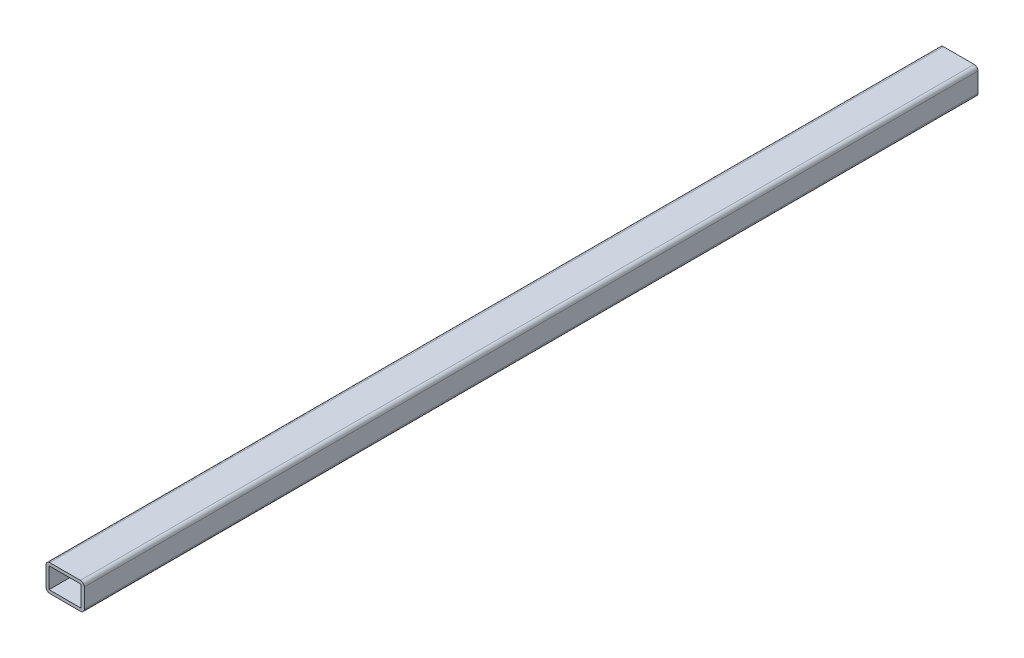
ISO-10303-21;
HEADER;
FILE_DESCRIPTION(('STEP AP214'),'2;1');
FILE_NAME('part.step','',(''),(''),'','','');
FILE_SCHEMA(('AUTOMOTIVE_DESIGN { 1 0 10303 214 1 1 1 1 }'));
ENDSEC;
DATA;
#1=APPLICATION_CONTEXT('core data for automotive mechanical design processes');
#2=APPLICATION_PROTOCOL_DEFINITION('international standard','automotive_design',2000,#1);
#3=PRODUCT_CONTEXT('',#1,'mechanical');
#4=PRODUCT('Part','Part','',(#3));
#5=PRODUCT_RELATED_PRODUCT_CATEGORY('part','',(#4));
#6=PRODUCT_DEFINITION_FORMATION('','',#4);
#7=PRODUCT_DEFINITION_CONTEXT('part definition',#1,'design');
#8=PRODUCT_DEFINITION('design','',#6,#7);
#9=PRODUCT_DEFINITION_SHAPE('','',#8);
#10=(LENGTH_UNIT() NAMED_UNIT(*) SI_UNIT(.MILLI.,.METRE.));
#11=(NAMED_UNIT(*) PLANE_ANGLE_UNIT() SI_UNIT($,.RADIAN.));
#12=(NAMED_UNIT(*) SI_UNIT($,.STERADIAN.) SOLID_ANGLE_UNIT());
#13=UNCERTAINTY_MEASURE_WITH_UNIT(LENGTH_MEASURE(1.E-05),#10,'distance_accuracy_value','');
#14=(GEOMETRIC_REPRESENTATION_CONTEXT(3) GLOBAL_UNCERTAINTY_ASSIGNED_CONTEXT((#13)) GLOBAL_UNIT_ASSIGNED_CONTEXT((#10,
#11,#12)) REPRESENTATION_CONTEXT('',''));
#15=CARTESIAN_POINT('',(0.,0.,0.));
#16=DIRECTION('',(0.,0.,1.));
#17=DIRECTION('',(1.,0.,0.));
#18=AXIS2_PLACEMENT_3D('',#15,#16,#17);
#19=CARTESIAN_POINT('',(2.99999999999999,18.,700.));
#20=DIRECTION('',(0.,0.,-1.));
#21=DIRECTION('',(-1.,0.,0.));
#22=AXIS2_PLACEMENT_3D('',#19,#20,#21);
#23=PLANE('',#22);
#24=CARTESIAN_POINT('',(2.99999999999999,18.,700.));
#25=DIRECTION('',(0.,0.,1.));
#26=DIRECTION('',(-1.,0.,0.));
#27=AXIS2_PLACEMENT_3D('',#24,#25,#26);
#28=CIRCLE('',#27,3.);
#29=CARTESIAN_POINT('',(3.00000000000001,21.,700.));
#30=VERTEX_POINT('',#29);
#31=CARTESIAN_POINT('',(0.,18.,700.));
#32=VERTEX_POINT('',#31);
#33=EDGE_CURVE('E181',#30,#32,#28,.T.);
#34=ORIENTED_EDGE('',*,*,#33,.T.);
#35=DIRECTION('',(0.,-1.,0.));
#36=VECTOR('',#35,1.);
#37=CARTESIAN_POINT('',(0.,18.,700.));
#38=LINE('',#37,#36);
#39=CARTESIAN_POINT('',(0.,3.00000000000002,700.));
#40=VERTEX_POINT('',#39);
#41=EDGE_CURVE('E185',#32,#40,#38,.T.);
#42=ORIENTED_EDGE('',*,*,#41,.T.);
#43=CARTESIAN_POINT('',(3.,3.,700.));
#44=DIRECTION('',(0.,0.,1.));
#45=DIRECTION('',(-1.,0.,0.));
#46=AXIS2_PLACEMENT_3D('',#43,#44,#45);
#47=CIRCLE('',#46,3.);
#48=CARTESIAN_POINT('',(3.00000000000002,0.,700.));
#49=VERTEX_POINT('',#48);
#50=EDGE_CURVE('E189',#40,#49,#47,.T.);
#51=ORIENTED_EDGE('',*,*,#50,.T.);
#52=DIRECTION('',(1.,0.,0.));
#53=VECTOR('',#52,1.);
#54=CARTESIAN_POINT('',(3.00000000000002,0.,700.));
#55=LINE('',#54,#53);
#56=CARTESIAN_POINT('',(27.,0.,700.));
#57=VERTEX_POINT('',#56);
#58=EDGE_CURVE('E192',#49,#57,#55,.T.);
#59=ORIENTED_EDGE('',*,*,#58,.T.);
#60=CARTESIAN_POINT('',(27.,3.,700.));
#61=DIRECTION('',(0.,0.,1.));
#62=DIRECTION('',(1.,0.,0.));
#63=AXIS2_PLACEMENT_3D('',#60,#61,#62);
#64=CIRCLE('',#63,3.);
#65=CARTESIAN_POINT('',(30.,3.,700.));
#66=VERTEX_POINT('',#65);
#67=EDGE_CURVE('E195',#57,#66,#64,.T.);
#68=ORIENTED_EDGE('',*,*,#67,.T.);
#69=DIRECTION('',(0.,1.,0.));
#70=VECTOR('',#69,1.);
#71=CARTESIAN_POINT('',(30.,3.00000000000002,700.));
#72=LINE('',#71,#70);
#73=CARTESIAN_POINT('',(30.,18.,700.));
#74=VERTEX_POINT('',#73);
#75=EDGE_CURVE('E198',#66,#74,#72,.T.);
#76=ORIENTED_EDGE('',*,*,#75,.T.);
#77=CARTESIAN_POINT('',(27.,18.,700.));
#78=DIRECTION('',(0.,0.,1.));
#79=DIRECTION('',(-1.,0.,0.));
#80=AXIS2_PLACEMENT_3D('',#77,#78,#79);
#81=CIRCLE('',#80,3.);
#82=CARTESIAN_POINT('',(27.,21.,700.));
#83=VERTEX_POINT('',#82);
#84=EDGE_CURVE('E201',#74,#83,#81,.T.);
#85=ORIENTED_EDGE('',*,*,#84,.T.);
#86=DIRECTION('',(-1.,0.,0.));
#87=VECTOR('',#86,1.);
#88=CARTESIAN_POINT('',(27.,21.,700.));
#89=LINE('',#88,#87);
#90=EDGE_CURVE('E204',#83,#30,#89,.T.);
#91=ORIENTED_EDGE('',*,*,#90,.T.);
#92=EDGE_LOOP('',(#34,#42,#51,#59,#68,#76,#85,#91));
#93=FACE_BOUND('',#92,.T.);
#94=DIRECTION('',(0.,-1.,0.));
#95=VECTOR('',#94,1.);
#96=CARTESIAN_POINT('',(2.39999999999999,18.6,700.));
#97=LINE('',#96,#95);
#98=CARTESIAN_POINT('',(2.39999999999999,18.6,700.));
#99=VERTEX_POINT('',#98);
#100=CARTESIAN_POINT('',(2.39999999999999,2.4,700.));
#101=VERTEX_POINT('',#100);
#102=EDGE_CURVE('E133',#99,#101,#97,.T.);
#103=ORIENTED_EDGE('',*,*,#102,.F.);
#104=DIRECTION('',(-1.,0.,0.));
#105=VECTOR('',#104,1.);
#106=CARTESIAN_POINT('',(27.6,18.6,700.));
#107=LINE('',#106,#105);
#108=CARTESIAN_POINT('',(27.6,18.6,700.));
#109=VERTEX_POINT('',#108);
#110=EDGE_CURVE('E159',#109,#99,#107,.T.);
#111=ORIENTED_EDGE('',*,*,#110,.F.);
#112=DIRECTION('',(0.,1.,0.));
#113=VECTOR('',#112,1.);
#114=CARTESIAN_POINT('',(27.6,2.4,700.));
#115=LINE('',#114,#113);
#116=CARTESIAN_POINT('',(27.6,2.4,700.));
#117=VERTEX_POINT('',#116);
#118=EDGE_CURVE('E155',#117,#109,#115,.T.);
#119=ORIENTED_EDGE('',*,*,#118,.F.);
#120=DIRECTION('',(1.,0.,0.));
#121=VECTOR('',#120,1.);
#122=CARTESIAN_POINT('',(2.39999999999999,2.4,700.));
#123=LINE('',#122,#121);
#124=EDGE_CURVE('E142',#101,#117,#123,.T.);
#125=ORIENTED_EDGE('',*,*,#124,.F.);
#126=EDGE_LOOP('',(#103,#111,#119,#125));
#127=FACE_BOUND('',#126,.T.);
#128=ADVANCED_FACE('F43',(#93,#127),#23,.F.);
#129=CARTESIAN_POINT('',(2.99999999999999,18.,0.));
#130=DIRECTION('',(0.,0.,-1.));
#131=DIRECTION('',(-1.,0.,0.));
#132=AXIS2_PLACEMENT_3D('',#129,#130,#131);
#133=PLANE('',#132);
#134=CARTESIAN_POINT('',(2.99999999999999,18.,0.));
#135=DIRECTION('',(0.,0.,1.));
#136=DIRECTION('',(-1.,0.,0.));
#137=AXIS2_PLACEMENT_3D('',#134,#135,#136);
#138=CIRCLE('',#137,3.);
#139=CARTESIAN_POINT('',(3.00000000000001,21.,0.));
#140=VERTEX_POINT('',#139);
#141=CARTESIAN_POINT('',(0.,18.,0.));
#142=VERTEX_POINT('',#141);
#143=EDGE_CURVE('E151',#140,#142,#138,.T.);
#144=ORIENTED_EDGE('',*,*,#143,.F.);
#145=DIRECTION('',(-1.,0.,0.));
#146=VECTOR('',#145,1.);
#147=CARTESIAN_POINT('',(27.,21.,0.));
#148=LINE('',#147,#146);
#149=CARTESIAN_POINT('',(27.,21.,0.));
#150=VERTEX_POINT('',#149);
#151=EDGE_CURVE('E186',#150,#140,#148,.T.);
#152=ORIENTED_EDGE('',*,*,#151,.F.);
#153=CARTESIAN_POINT('',(27.,18.,0.));
#154=DIRECTION('',(0.,0.,1.));
#155=DIRECTION('',(-1.,0.,0.));
#156=AXIS2_PLACEMENT_3D('',#153,#154,#155);
#157=CIRCLE('',#156,3.);
#158=CARTESIAN_POINT('',(30.,18.,0.));
#159=VERTEX_POINT('',#158);
#160=EDGE_CURVE('E226',#159,#150,#157,.T.);
#161=ORIENTED_EDGE('',*,*,#160,.F.);
#162=DIRECTION('',(0.,1.,0.));
#163=VECTOR('',#162,1.);
#164=CARTESIAN_POINT('',(30.,3.00000000000002,0.));
#165=LINE('',#164,#163);
#166=CARTESIAN_POINT('',(30.,3.,0.));
#167=VERTEX_POINT('',#166);
#168=EDGE_CURVE('E223',#167,#159,#165,.T.);
#169=ORIENTED_EDGE('',*,*,#168,.F.);
#170=CARTESIAN_POINT('',(27.,3.,0.));
#171=DIRECTION('',(0.,0.,1.));
#172=DIRECTION('',(1.,0.,0.));
#173=AXIS2_PLACEMENT_3D('',#170,#171,#172);
#174=CIRCLE('',#173,3.);
#175=CARTESIAN_POINT('',(27.,0.,0.));
#176=VERTEX_POINT('',#175);
#177=EDGE_CURVE('E220',#176,#167,#174,.T.);
#178=ORIENTED_EDGE('',*,*,#177,.F.);
#179=DIRECTION('',(1.,0.,0.));
#180=VECTOR('',#179,1.);
#181=CARTESIAN_POINT('',(3.00000000000002,0.,0.));
#182=LINE('',#181,#180);
#183=CARTESIAN_POINT('',(3.00000000000002,0.,0.));
#184=VERTEX_POINT('',#183);
#185=EDGE_CURVE('E217',#184,#176,#182,.T.);
#186=ORIENTED_EDGE('',*,*,#185,.F.);
#187=CARTESIAN_POINT('',(3.,3.,0.));
#188=DIRECTION('',(0.,0.,1.));
#189=DIRECTION('',(-1.,0.,0.));
#190=AXIS2_PLACEMENT_3D('',#187,#188,#189);
#191=CIRCLE('',#190,3.);
#192=CARTESIAN_POINT('',(0.,3.00000000000002,0.));
#193=VERTEX_POINT('',#192);
#194=EDGE_CURVE('E214',#193,#184,#191,.T.);
#195=ORIENTED_EDGE('',*,*,#194,.F.);
#196=DIRECTION('',(0.,-1.,0.));
#197=VECTOR('',#196,1.);
#198=CARTESIAN_POINT('',(0.,18.,0.));
#199=LINE('',#198,#197);
#200=EDGE_CURVE('E211',#142,#193,#199,.T.);
#201=ORIENTED_EDGE('',*,*,#200,.F.);
#202=EDGE_LOOP('',(#144,#152,#161,#169,#178,#186,#195,#201));
#203=FACE_BOUND('',#202,.T.);
#204=DIRECTION('',(-1.,0.,0.));
#205=VECTOR('',#204,1.);
#206=CARTESIAN_POINT('',(27.6,18.6,0.));
#207=LINE('',#206,#205);
#208=CARTESIAN_POINT('',(27.6,18.6,0.));
#209=VERTEX_POINT('',#208);
#210=CARTESIAN_POINT('',(2.39999999999999,18.6,0.));
#211=VERTEX_POINT('',#210);
#212=EDGE_CURVE('E143',#209,#211,#207,.T.);
#213=ORIENTED_EDGE('',*,*,#212,.T.);
#214=DIRECTION('',(0.,-1.,0.));
#215=VECTOR('',#214,1.);
#216=CARTESIAN_POINT('',(2.39999999999999,18.6,0.));
#217=LINE('',#216,#215);
#218=CARTESIAN_POINT('',(2.39999999999999,2.4,0.));
#219=VERTEX_POINT('',#218);
#220=EDGE_CURVE('E67',#211,#219,#217,.T.);
#221=ORIENTED_EDGE('',*,*,#220,.T.);
#222=DIRECTION('',(1.,0.,0.));
#223=VECTOR('',#222,1.);
#224=CARTESIAN_POINT('',(2.39999999999999,2.4,0.));
#225=LINE('',#224,#223);
#226=CARTESIAN_POINT('',(27.6,2.4,0.));
#227=VERTEX_POINT('',#226);
#228=EDGE_CURVE('E149',#219,#227,#225,.T.);
#229=ORIENTED_EDGE('',*,*,#228,.T.);
#230=DIRECTION('',(0.,1.,0.));
#231=VECTOR('',#230,1.);
#232=CARTESIAN_POINT('',(27.6,2.4,0.));
#233=LINE('',#232,#231);
#234=EDGE_CURVE('E168',#227,#209,#233,.T.);
#235=ORIENTED_EDGE('',*,*,#234,.T.);
#236=EDGE_LOOP('',(#213,#221,#229,#235));
#237=FACE_BOUND('',#236,.T.);
#238=ADVANCED_FACE('F265',(#203,#237),#133,.T.);
#239=CARTESIAN_POINT('',(2.99999999999999,18.,700.));
#240=DIRECTION('',(0.,0.,-1.));
#241=DIRECTION('',(-1.,0.,0.));
#242=AXIS2_PLACEMENT_3D('',#239,#240,#241);
#243=CYLINDRICAL_SURFACE('',#242,3.);
#244=ORIENTED_EDGE('',*,*,#143,.T.);
#245=DIRECTION('',(0.,0.,-1.));
#246=VECTOR('',#245,1.);
#247=CARTESIAN_POINT('',(0.,18.,700.));
#248=LINE('',#247,#246);
#249=EDGE_CURVE('E11',#32,#142,#248,.T.);
#250=ORIENTED_EDGE('',*,*,#249,.F.);
#251=ORIENTED_EDGE('',*,*,#33,.F.);
#252=DIRECTION('',(0.,0.,-1.));
#253=VECTOR('',#252,1.);
#254=CARTESIAN_POINT('',(3.00000000000001,21.,700.));
#255=LINE('',#254,#253);
#256=EDGE_CURVE('E207',#30,#140,#255,.T.);
#257=ORIENTED_EDGE('',*,*,#256,.T.);
#258=EDGE_LOOP('',(#244,#250,#251,#257));
#259=FACE_BOUND('',#258,.T.);
#260=ADVANCED_FACE('F45',(#259),#243,.T.);
#261=CARTESIAN_POINT('',(0.,18.,700.));
#262=DIRECTION('',(1.,0.,0.));
#263=DIRECTION('',(0.,1.,0.));
#264=AXIS2_PLACEMENT_3D('',#261,#262,#263);
#265=PLANE('',#264);
#266=ORIENTED_EDGE('',*,*,#200,.T.);
#267=DIRECTION('',(0.,0.,-1.));
#268=VECTOR('',#267,1.);
#269=CARTESIAN_POINT('',(0.,3.00000000000002,700.));
#270=LINE('',#269,#268);
#271=EDGE_CURVE('E52',#40,#193,#270,.T.);
#272=ORIENTED_EDGE('',*,*,#271,.F.);
#273=ORIENTED_EDGE('',*,*,#41,.F.);
#274=ORIENTED_EDGE('',*,*,#249,.T.);
#275=EDGE_LOOP('',(#266,#272,#273,#274));
#276=FACE_BOUND('',#275,.T.);
#277=ADVANCED_FACE('F282',(#276),#265,.F.);
#278=CARTESIAN_POINT('',(3.,3.,700.));
#279=DIRECTION('',(0.,0.,-1.));
#280=DIRECTION('',(-1.,0.,0.));
#281=AXIS2_PLACEMENT_3D('',#278,#279,#280);
#282=CYLINDRICAL_SURFACE('',#281,3.);
#283=ORIENTED_EDGE('',*,*,#194,.T.);
#284=DIRECTION('',(0.,0.,-1.));
#285=VECTOR('',#284,1.);
#286=CARTESIAN_POINT('',(3.00000000000002,0.,700.));
#287=LINE('',#286,#285);
#288=EDGE_CURVE('E250',#49,#184,#287,.T.);
#289=ORIENTED_EDGE('',*,*,#288,.F.);
#290=ORIENTED_EDGE('',*,*,#50,.F.);
#291=ORIENTED_EDGE('',*,*,#271,.T.);
#292=EDGE_LOOP('',(#283,#289,#290,#291));
#293=FACE_BOUND('',#292,.T.);
#294=ADVANCED_FACE('F259',(#293),#282,.T.);
#295=CARTESIAN_POINT('',(3.00000000000002,0.,700.));
#296=DIRECTION('',(0.,1.,0.));
#297=DIRECTION('',(0.,0.,1.));
#298=AXIS2_PLACEMENT_3D('',#295,#296,#297);
#299=PLANE('',#298);
#300=ORIENTED_EDGE('',*,*,#185,.T.);
#301=DIRECTION('',(0.,0.,-1.));
#302=VECTOR('',#301,1.);
#303=CARTESIAN_POINT('',(27.,0.,700.));
#304=LINE('',#303,#302);
#305=EDGE_CURVE('E246',#57,#176,#304,.T.);
#306=ORIENTED_EDGE('',*,*,#305,.F.);
#307=ORIENTED_EDGE('',*,*,#58,.F.);
#308=ORIENTED_EDGE('',*,*,#288,.T.);
#309=EDGE_LOOP('',(#300,#306,#307,#308));
#310=FACE_BOUND('',#309,.T.);
#311=ADVANCED_FACE('F271',(#310),#299,.F.);
#312=CARTESIAN_POINT('',(27.,3.,700.));
#313=DIRECTION('',(0.,0.,-1.));
#314=DIRECTION('',(-1.,0.,0.));
#315=AXIS2_PLACEMENT_3D('',#312,#313,#314);
#316=CYLINDRICAL_SURFACE('',#315,3.);
#317=ORIENTED_EDGE('',*,*,#177,.T.);
#318=DIRECTION('',(0.,0.,-1.));
#319=VECTOR('',#318,1.);
#320=CARTESIAN_POINT('',(30.,3.,700.));
#321=LINE('',#320,#319);
#322=EDGE_CURVE('E242',#66,#167,#321,.T.);
#323=ORIENTED_EDGE('',*,*,#322,.F.);
#324=ORIENTED_EDGE('',*,*,#67,.F.);
#325=ORIENTED_EDGE('',*,*,#305,.T.);
#326=EDGE_LOOP('',(#317,#323,#324,#325));
#327=FACE_BOUND('',#326,.T.);
#328=ADVANCED_FACE('F275',(#327),#316,.T.);
#329=CARTESIAN_POINT('',(30.,3.00000000000002,700.));
#330=DIRECTION('',(-1.,0.,0.));
#331=DIRECTION('',(0.,-1.,0.));
#332=AXIS2_PLACEMENT_3D('',#329,#330,#331);
#333=PLANE('',#332);
#334=ORIENTED_EDGE('',*,*,#168,.T.);
#335=DIRECTION('',(0.,0.,-1.));
#336=VECTOR('',#335,1.);
#337=CARTESIAN_POINT('',(30.,18.,700.));
#338=LINE('',#337,#336);
#339=EDGE_CURVE('E238',#74,#159,#338,.T.);
#340=ORIENTED_EDGE('',*,*,#339,.F.);
#341=ORIENTED_EDGE('',*,*,#75,.F.);
#342=ORIENTED_EDGE('',*,*,#322,.T.);
#343=EDGE_LOOP('',(#334,#340,#341,#342));
#344=FACE_BOUND('',#343,.T.);
#345=ADVANCED_FACE('F295',(#344),#333,.F.);
#346=CARTESIAN_POINT('',(27.,18.,700.));
#347=DIRECTION('',(0.,0.,-1.));
#348=DIRECTION('',(-1.,0.,0.));
#349=AXIS2_PLACEMENT_3D('',#346,#347,#348);
#350=CYLINDRICAL_SURFACE('',#349,3.);
#351=ORIENTED_EDGE('',*,*,#160,.T.);
#352=DIRECTION('',(0.,0.,-1.));
#353=VECTOR('',#352,1.);
#354=CARTESIAN_POINT('',(27.,21.,700.));
#355=LINE('',#354,#353);
#356=EDGE_CURVE('E234',#83,#150,#355,.T.);
#357=ORIENTED_EDGE('',*,*,#356,.F.);
#358=ORIENTED_EDGE('',*,*,#84,.F.);
#359=ORIENTED_EDGE('',*,*,#339,.T.);
#360=EDGE_LOOP('',(#351,#357,#358,#359));
#361=FACE_BOUND('',#360,.T.);
#362=ADVANCED_FACE('F293',(#361),#350,.T.);
#363=CARTESIAN_POINT('',(27.,21.,700.));
#364=DIRECTION('',(0.,-1.,0.));
#365=DIRECTION('',(0.,0.,-1.));
#366=AXIS2_PLACEMENT_3D('',#363,#364,#365);
#367=PLANE('',#366);
#368=ORIENTED_EDGE('',*,*,#151,.T.);
#369=ORIENTED_EDGE('',*,*,#256,.F.);
#370=ORIENTED_EDGE('',*,*,#90,.F.);
#371=ORIENTED_EDGE('',*,*,#356,.T.);
#372=EDGE_LOOP('',(#368,#369,#370,#371));
#373=FACE_BOUND('',#372,.T.);
#374=ADVANCED_FACE('F288',(#373),#367,.F.);
#375=CARTESIAN_POINT('',(2.39999999999999,18.6,700.));
#376=DIRECTION('',(1.,0.,0.));
#377=DIRECTION('',(0.,0.,-1.));
#378=AXIS2_PLACEMENT_3D('',#375,#376,#377);
#379=PLANE('',#378);
#380=ORIENTED_EDGE('',*,*,#220,.F.);
#381=DIRECTION('',(0.,0.,-1.));
#382=VECTOR('',#381,1.);
#383=CARTESIAN_POINT('',(2.39999999999999,18.6,700.));
#384=LINE('',#383,#382);
#385=EDGE_CURVE('E137',#99,#211,#384,.T.);
#386=ORIENTED_EDGE('',*,*,#385,.F.);
#387=ORIENTED_EDGE('',*,*,#102,.T.);
#388=DIRECTION('',(0.,0.,-1.));
#389=VECTOR('',#388,1.);
#390=CARTESIAN_POINT('',(2.39999999999999,2.4,700.));
#391=LINE('',#390,#389);
#392=EDGE_CURVE('E136',#101,#219,#391,.T.);
#393=ORIENTED_EDGE('',*,*,#392,.T.);
#394=EDGE_LOOP('',(#380,#386,#387,#393));
#395=FACE_BOUND('',#394,.T.);
#396=ADVANCED_FACE('F135',(#395),#379,.T.);
#397=CARTESIAN_POINT('',(2.39999999999999,2.4,700.));
#398=DIRECTION('',(0.,1.,0.));
#399=DIRECTION('',(0.,0.,1.));
#400=AXIS2_PLACEMENT_3D('',#397,#398,#399);
#401=PLANE('',#400);
#402=ORIENTED_EDGE('',*,*,#228,.F.);
#403=ORIENTED_EDGE('',*,*,#392,.F.);
#404=ORIENTED_EDGE('',*,*,#124,.T.);
#405=DIRECTION('',(0.,0.,-1.));
#406=VECTOR('',#405,1.);
#407=CARTESIAN_POINT('',(27.6,2.4,700.));
#408=LINE('',#407,#406);
#409=EDGE_CURVE('E152',#117,#227,#408,.T.);
#410=ORIENTED_EDGE('',*,*,#409,.T.);
#411=EDGE_LOOP('',(#402,#403,#404,#410));
#412=FACE_BOUND('',#411,.T.);
#413=ADVANCED_FACE('F146',(#412),#401,.T.);
#414=CARTESIAN_POINT('',(27.6,2.4,700.));
#415=DIRECTION('',(-1.,0.,0.));
#416=DIRECTION('',(0.,0.,1.));
#417=AXIS2_PLACEMENT_3D('',#414,#415,#416);
#418=PLANE('',#417);
#419=ORIENTED_EDGE('',*,*,#234,.F.);
#420=ORIENTED_EDGE('',*,*,#409,.F.);
#421=ORIENTED_EDGE('',*,*,#118,.T.);
#422=DIRECTION('',(0.,0.,-1.));
#423=VECTOR('',#422,1.);
#424=CARTESIAN_POINT('',(27.6,18.6,700.));
#425=LINE('',#424,#423);
#426=EDGE_CURVE('E59',#109,#209,#425,.T.);
#427=ORIENTED_EDGE('',*,*,#426,.T.);
#428=EDGE_LOOP('',(#419,#420,#421,#427));
#429=FACE_BOUND('',#428,.T.);
#430=ADVANCED_FACE('F320',(#429),#418,.T.);
#431=CARTESIAN_POINT('',(27.6,18.6,700.));
#432=DIRECTION('',(0.,-1.,0.));
#433=DIRECTION('',(0.,0.,-1.));
#434=AXIS2_PLACEMENT_3D('',#431,#432,#433);
#435=PLANE('',#434);
#436=ORIENTED_EDGE('',*,*,#212,.F.);
#437=ORIENTED_EDGE('',*,*,#426,.F.);
#438=ORIENTED_EDGE('',*,*,#110,.T.);
#439=ORIENTED_EDGE('',*,*,#385,.T.);
#440=EDGE_LOOP('',(#436,#437,#438,#439));
#441=FACE_BOUND('',#440,.T.);
#442=ADVANCED_FACE('F324',(#441),#435,.T.);
#443=CLOSED_SHELL('',(#128,#238,#260,#277,#294,#311,#328,#345,#362,#374,#396,#413,#430,#442));
#444=MANIFOLD_SOLID_BREP('B2',#443);
#445=ADVANCED_BREP_SHAPE_REPRESENTATION('',(#18,#444),#14);
#446=SHAPE_DEFINITION_REPRESENTATION(#9,#445);
ENDSEC;
END-ISO-10303-21;
